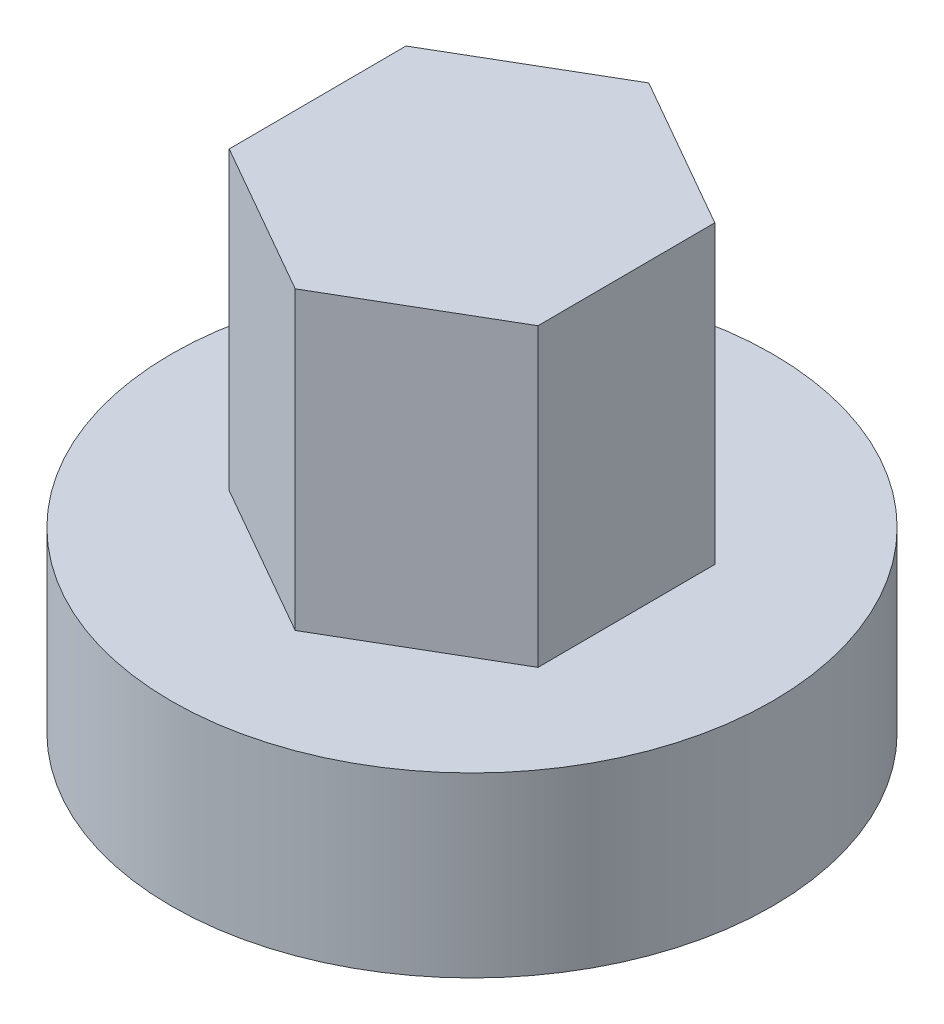
ISO-10303-21;
HEADER;
FILE_DESCRIPTION(('STEP AP214'),'2;1');
FILE_NAME('part.step','',(''),(''),'','','');
FILE_SCHEMA(('AUTOMOTIVE_DESIGN { 1 0 10303 214 1 1 1 1 }'));
ENDSEC;
DATA;
#1=APPLICATION_CONTEXT('core data for automotive mechanical design processes');
#2=APPLICATION_PROTOCOL_DEFINITION('international standard','automotive_design',2000,#1);
#3=PRODUCT_CONTEXT('',#1,'mechanical');
#4=PRODUCT('Part','Part','',(#3));
#5=PRODUCT_RELATED_PRODUCT_CATEGORY('part','',(#4));
#6=PRODUCT_DEFINITION_FORMATION('','',#4);
#7=PRODUCT_DEFINITION_CONTEXT('part definition',#1,'design');
#8=PRODUCT_DEFINITION('design','',#6,#7);
#9=PRODUCT_DEFINITION_SHAPE('','',#8);
#10=(LENGTH_UNIT() NAMED_UNIT(*) SI_UNIT(.MILLI.,.METRE.));
#11=(NAMED_UNIT(*) PLANE_ANGLE_UNIT() SI_UNIT($,.RADIAN.));
#12=(NAMED_UNIT(*) SI_UNIT($,.STERADIAN.) SOLID_ANGLE_UNIT());
#13=UNCERTAINTY_MEASURE_WITH_UNIT(LENGTH_MEASURE(1.E-05),#10,'distance_accuracy_value','');
#14=(GEOMETRIC_REPRESENTATION_CONTEXT(3) GLOBAL_UNCERTAINTY_ASSIGNED_CONTEXT((#13)) GLOBAL_UNIT_ASSIGNED_CONTEXT((#10,
#11,#12)) REPRESENTATION_CONTEXT('',''));
#15=CARTESIAN_POINT('',(0.,0.,0.));
#16=DIRECTION('',(0.,0.,1.));
#17=DIRECTION('',(1.,0.,0.));
#18=AXIS2_PLACEMENT_3D('',#15,#16,#17);
#19=CARTESIAN_POINT('',(0.,-15.,0.));
#20=DIRECTION('',(0.,1.,0.));
#21=DIRECTION('',(0.,0.,1.));
#22=AXIS2_PLACEMENT_3D('',#19,#20,#21);
#23=CYLINDRICAL_SURFACE('',#22,25.4);
#24=CARTESIAN_POINT('',(0.,-15.,0.));
#25=DIRECTION('',(0.,1.,0.));
#26=DIRECTION('',(0.,0.,1.));
#27=AXIS2_PLACEMENT_3D('',#24,#25,#26);
#28=CIRCLE('',#27,25.4);
#29=CARTESIAN_POINT('',(0.,-15.,25.4));
#30=VERTEX_POINT('',#29);
#31=EDGE_CURVE('E11',#30,#30,#28,.T.);
#32=ORIENTED_EDGE('',*,*,#31,.T.);
#33=EDGE_LOOP('',(#32));
#34=FACE_BOUND('',#33,.T.);
#35=CARTESIAN_POINT('',(0.,0.,0.));
#36=DIRECTION('',(0.,1.,0.));
#37=DIRECTION('',(0.,0.,1.));
#38=AXIS2_PLACEMENT_3D('',#35,#36,#37);
#39=CIRCLE('',#38,25.4);
#40=CARTESIAN_POINT('',(0.,0.,25.4));
#41=VERTEX_POINT('',#40);
#42=EDGE_CURVE('E48',#41,#41,#39,.T.);
#43=ORIENTED_EDGE('',*,*,#42,.F.);
#44=EDGE_LOOP('',(#43));
#45=FACE_BOUND('',#44,.T.);
#46=ADVANCED_FACE('F45',(#34,#45),#23,.T.);
#47=CARTESIAN_POINT('',(0.,-15.,0.));
#48=DIRECTION('',(0.,1.,0.));
#49=DIRECTION('',(0.,0.,1.));
#50=AXIS2_PLACEMENT_3D('',#47,#48,#49);
#51=PLANE('',#50);
#52=ORIENTED_EDGE('',*,*,#31,.F.);
#53=EDGE_LOOP('',(#52));
#54=FACE_BOUND('',#53,.T.);
#55=ADVANCED_FACE('F191',(#54),#51,.F.);
#56=CARTESIAN_POINT('',(0.,0.,0.));
#57=DIRECTION('',(0.,1.,0.));
#58=DIRECTION('',(0.,0.,1.));
#59=AXIS2_PLACEMENT_3D('',#56,#57,#58);
#60=PLANE('',#59);
#61=DIRECTION('',(-0.00429180596635259,0.,-0.999990790158363));
#62=VECTOR('',#61,1.);
#63=CARTESIAN_POINT('',(12.9902614174142,0.,-0.0557521949246244));
#64=LINE('',#63,#62);
#65=CARTESIAN_POINT('',(13.0224499621619,0.,7.44417873126309));
#66=VERTEX_POINT('',#65);
#67=CARTESIAN_POINT('',(12.9580728726666,0.,-7.55568312111235));
#68=VERTEX_POINT('',#67);
#69=EDGE_CURVE('E60',#66,#68,#64,.T.);
#70=ORIENTED_EDGE('',*,*,#69,.F.);
#71=DIRECTION('',(0.86387152484444,0.,-0.503712208074157));
#72=VECTOR('',#71,1.);
#73=CARTESIAN_POINT('',(6.54341352582859,0.,11.2220202918193));
#74=LINE('',#73,#72);
#75=CARTESIAN_POINT('',(0.0643770894952905,0.,14.9998618523754));
#76=VERTEX_POINT('',#75);
#77=EDGE_CURVE('E64',#76,#66,#74,.T.);
#78=ORIENTED_EDGE('',*,*,#77,.F.);
#79=DIRECTION('',(0.868163330810793,0.,0.496278582084206));
#80=VECTOR('',#79,1.);
#81=CARTESIAN_POINT('',(-6.44684789158565,0.,11.2777724867439));
#82=LINE('',#81,#80);
#83=CARTESIAN_POINT('',(-12.9580728726666,0.,7.55568312111235));
#84=VERTEX_POINT('',#83);
#85=EDGE_CURVE('E144',#84,#76,#82,.T.);
#86=ORIENTED_EDGE('',*,*,#85,.F.);
#87=DIRECTION('',(0.0042918059663527,0.,0.999990790158363));
#88=VECTOR('',#87,1.);
#89=CARTESIAN_POINT('',(-12.9902614174142,0.,0.0557521949246259));
#90=LINE('',#89,#88);
#91=CARTESIAN_POINT('',(-13.0224499621619,0.,-7.44417873126309));
#92=VERTEX_POINT('',#91);
#93=EDGE_CURVE('E147',#92,#84,#90,.T.);
#94=ORIENTED_EDGE('',*,*,#93,.F.);
#95=DIRECTION('',(-0.86387152484444,0.,0.503712208074157));
#96=VECTOR('',#95,1.);
#97=CARTESIAN_POINT('',(-6.54341352582859,0.,-11.2220202918193));
#98=LINE('',#97,#96);
#99=CARTESIAN_POINT('',(-0.0643770894952931,0.,-14.9998618523754));
#100=VERTEX_POINT('',#99);
#101=EDGE_CURVE('E151',#100,#92,#98,.T.);
#102=ORIENTED_EDGE('',*,*,#101,.F.);
#103=DIRECTION('',(-0.868163330810793,0.,-0.496278582084206));
#104=VECTOR('',#103,1.);
#105=CARTESIAN_POINT('',(6.44684789158565,0.,-11.2777724867439));
#106=LINE('',#105,#104);
#107=EDGE_CURVE('E155',#68,#100,#106,.T.);
#108=ORIENTED_EDGE('',*,*,#107,.F.);
#109=EDGE_LOOP('',(#70,#78,#86,#94,#102,#108));
#110=FACE_BOUND('',#109,.T.);
#111=ORIENTED_EDGE('',*,*,#42,.T.);
#112=EDGE_LOOP('',(#111));
#113=FACE_BOUND('',#112,.T.);
#114=ADVANCED_FACE('F196',(#110,#113),#60,.T.);
#115=CARTESIAN_POINT('',(12.9902614174142,25.,-0.0557521949246244));
#116=DIRECTION('',(-0.999990790158363,0.,0.00429180596635259));
#117=DIRECTION('',(0.00429180596635259,0.,0.999990790158363));
#118=AXIS2_PLACEMENT_3D('',#115,#116,#117);
#119=PLANE('',#118);
#120=ORIENTED_EDGE('',*,*,#69,.T.);
#121=DIRECTION('',(0.,-1.,0.));
#122=VECTOR('',#121,1.);
#123=CARTESIAN_POINT('',(12.9580728726666,25.,-7.55568312111235));
#124=LINE('',#123,#122);
#125=CARTESIAN_POINT('',(12.9580728726666,25.,-7.55568312111235));
#126=VERTEX_POINT('',#125);
#127=EDGE_CURVE('E101',#126,#68,#124,.T.);
#128=ORIENTED_EDGE('',*,*,#127,.F.);
#129=DIRECTION('',(-0.00429180596635259,0.,-0.999990790158363));
#130=VECTOR('',#129,1.);
#131=CARTESIAN_POINT('',(12.9902614174142,25.,-0.0557521949246244));
#132=LINE('',#131,#130);
#133=CARTESIAN_POINT('',(13.0224499621619,25.,7.44417873126309));
#134=VERTEX_POINT('',#133);
#135=EDGE_CURVE('E108',#134,#126,#132,.T.);
#136=ORIENTED_EDGE('',*,*,#135,.F.);
#137=DIRECTION('',(0.,-1.,0.));
#138=VECTOR('',#137,1.);
#139=CARTESIAN_POINT('',(13.0224499621619,25.,7.44417873126309));
#140=LINE('',#139,#138);
#141=EDGE_CURVE('E139',#134,#66,#140,.T.);
#142=ORIENTED_EDGE('',*,*,#141,.T.);
#143=EDGE_LOOP('',(#120,#128,#136,#142));
#144=FACE_BOUND('',#143,.T.);
#145=ADVANCED_FACE('F119',(#144),#119,.F.);
#146=CARTESIAN_POINT('',(6.44684789158565,25.,-11.2777724867439));
#147=DIRECTION('',(-0.496278582084206,0.,0.868163330810793));
#148=DIRECTION('',(0.868163330810793,0.,0.496278582084206));
#149=AXIS2_PLACEMENT_3D('',#146,#147,#148);
#150=PLANE('',#149);
#151=ORIENTED_EDGE('',*,*,#107,.T.);
#152=DIRECTION('',(0.,-1.,0.));
#153=VECTOR('',#152,1.);
#154=CARTESIAN_POINT('',(-0.0643770894952931,25.,-14.9998618523754));
#155=LINE('',#154,#153);
#156=CARTESIAN_POINT('',(-0.0643770894952931,25.,-14.9998618523754));
#157=VERTEX_POINT('',#156);
#158=EDGE_CURVE('E103',#157,#100,#155,.T.);
#159=ORIENTED_EDGE('',*,*,#158,.F.);
#160=DIRECTION('',(-0.868163330810793,0.,-0.496278582084206));
#161=VECTOR('',#160,1.);
#162=CARTESIAN_POINT('',(6.44684789158565,25.,-11.2777724867439));
#163=LINE('',#162,#161);
#164=EDGE_CURVE('E96',#126,#157,#163,.T.);
#165=ORIENTED_EDGE('',*,*,#164,.F.);
#166=ORIENTED_EDGE('',*,*,#127,.T.);
#167=EDGE_LOOP('',(#151,#159,#165,#166));
#168=FACE_BOUND('',#167,.T.);
#169=ADVANCED_FACE('F99',(#168),#150,.F.);
#170=CARTESIAN_POINT('',(-6.54341352582859,25.,-11.2220202918193));
#171=DIRECTION('',(0.503712208074157,0.,0.86387152484444));
#172=DIRECTION('',(0.86387152484444,0.,-0.503712208074157));
#173=AXIS2_PLACEMENT_3D('',#170,#171,#172);
#174=PLANE('',#173);
#175=ORIENTED_EDGE('',*,*,#101,.T.);
#176=DIRECTION('',(0.,-1.,0.));
#177=VECTOR('',#176,1.);
#178=CARTESIAN_POINT('',(-13.0224499621619,25.,-7.44417873126309));
#179=LINE('',#178,#177);
#180=CARTESIAN_POINT('',(-13.0224499621619,25.,-7.44417873126309));
#181=VERTEX_POINT('',#180);
#182=EDGE_CURVE('E125',#181,#92,#179,.T.);
#183=ORIENTED_EDGE('',*,*,#182,.F.);
#184=DIRECTION('',(-0.86387152484444,0.,0.503712208074157));
#185=VECTOR('',#184,1.);
#186=CARTESIAN_POINT('',(-6.54341352582859,25.,-11.2220202918193));
#187=LINE('',#186,#185);
#188=EDGE_CURVE('E107',#157,#181,#187,.T.);
#189=ORIENTED_EDGE('',*,*,#188,.F.);
#190=ORIENTED_EDGE('',*,*,#158,.T.);
#191=EDGE_LOOP('',(#175,#183,#189,#190));
#192=FACE_BOUND('',#191,.T.);
#193=ADVANCED_FACE('F173',(#192),#174,.F.);
#194=CARTESIAN_POINT('',(-12.9902614174142,25.,0.0557521949246259));
#195=DIRECTION('',(0.999990790158363,0.,-0.0042918059663527));
#196=DIRECTION('',(-0.0042918059663527,0.,-0.999990790158363));
#197=AXIS2_PLACEMENT_3D('',#194,#195,#196);
#198=PLANE('',#197);
#199=ORIENTED_EDGE('',*,*,#93,.T.);
#200=DIRECTION('',(0.,-1.,0.));
#201=VECTOR('',#200,1.);
#202=CARTESIAN_POINT('',(-12.9580728726666,25.,7.55568312111235));
#203=LINE('',#202,#201);
#204=CARTESIAN_POINT('',(-12.9580728726666,25.,7.55568312111235));
#205=VERTEX_POINT('',#204);
#206=EDGE_CURVE('E131',#205,#84,#203,.T.);
#207=ORIENTED_EDGE('',*,*,#206,.F.);
#208=DIRECTION('',(0.0042918059663527,0.,0.999990790158363));
#209=VECTOR('',#208,1.);
#210=CARTESIAN_POINT('',(-12.9902614174142,25.,0.0557521949246259));
#211=LINE('',#210,#209);
#212=EDGE_CURVE('E165',#181,#205,#211,.T.);
#213=ORIENTED_EDGE('',*,*,#212,.F.);
#214=ORIENTED_EDGE('',*,*,#182,.T.);
#215=EDGE_LOOP('',(#199,#207,#213,#214));
#216=FACE_BOUND('',#215,.T.);
#217=ADVANCED_FACE('F175',(#216),#198,.F.);
#218=CARTESIAN_POINT('',(-6.44684789158565,25.,11.2777724867439));
#219=DIRECTION('',(0.496278582084206,0.,-0.868163330810793));
#220=DIRECTION('',(-0.868163330810793,0.,-0.496278582084206));
#221=AXIS2_PLACEMENT_3D('',#218,#219,#220);
#222=PLANE('',#221);
#223=ORIENTED_EDGE('',*,*,#85,.T.);
#224=DIRECTION('',(0.,-1.,0.));
#225=VECTOR('',#224,1.);
#226=CARTESIAN_POINT('',(0.0643770894952905,25.,14.9998618523754));
#227=LINE('',#226,#225);
#228=CARTESIAN_POINT('',(0.0643770894952905,25.,14.9998618523754));
#229=VERTEX_POINT('',#228);
#230=EDGE_CURVE('E135',#229,#76,#227,.T.);
#231=ORIENTED_EDGE('',*,*,#230,.F.);
#232=DIRECTION('',(0.868163330810793,0.,0.496278582084206));
#233=VECTOR('',#232,1.);
#234=CARTESIAN_POINT('',(-6.44684789158565,25.,11.2777724867439));
#235=LINE('',#234,#233);
#236=EDGE_CURVE('E162',#205,#229,#235,.T.);
#237=ORIENTED_EDGE('',*,*,#236,.F.);
#238=ORIENTED_EDGE('',*,*,#206,.T.);
#239=EDGE_LOOP('',(#223,#231,#237,#238));
#240=FACE_BOUND('',#239,.T.);
#241=ADVANCED_FACE('F179',(#240),#222,.F.);
#242=CARTESIAN_POINT('',(6.54341352582859,25.,11.2220202918193));
#243=DIRECTION('',(-0.503712208074157,0.,-0.86387152484444));
#244=DIRECTION('',(-0.86387152484444,0.,0.503712208074157));
#245=AXIS2_PLACEMENT_3D('',#242,#243,#244);
#246=PLANE('',#245);
#247=ORIENTED_EDGE('',*,*,#77,.T.);
#248=ORIENTED_EDGE('',*,*,#141,.F.);
#249=DIRECTION('',(0.86387152484444,0.,-0.503712208074157));
#250=VECTOR('',#249,1.);
#251=CARTESIAN_POINT('',(6.54341352582859,25.,11.2220202918193));
#252=LINE('',#251,#250);
#253=EDGE_CURVE('E113',#229,#134,#252,.T.);
#254=ORIENTED_EDGE('',*,*,#253,.F.);
#255=ORIENTED_EDGE('',*,*,#230,.T.);
#256=EDGE_LOOP('',(#247,#248,#254,#255));
#257=FACE_BOUND('',#256,.T.);
#258=ADVANCED_FACE('F181',(#257),#246,.F.);
#259=CARTESIAN_POINT('',(0.,25.,0.));
#260=DIRECTION('',(0.,1.,0.));
#261=DIRECTION('',(0.,0.,1.));
#262=AXIS2_PLACEMENT_3D('',#259,#260,#261);
#263=PLANE('',#262);
#264=ORIENTED_EDGE('',*,*,#135,.T.);
#265=ORIENTED_EDGE('',*,*,#164,.T.);
#266=ORIENTED_EDGE('',*,*,#188,.T.);
#267=ORIENTED_EDGE('',*,*,#212,.T.);
#268=ORIENTED_EDGE('',*,*,#236,.T.);
#269=ORIENTED_EDGE('',*,*,#253,.T.);
#270=EDGE_LOOP('',(#264,#265,#266,#267,#268,#269));
#271=FACE_BOUND('',#270,.T.);
#272=ADVANCED_FACE('F111',(#271),#263,.T.);
#273=CLOSED_SHELL('',(#46,#55,#114,#145,#169,#193,#217,#241,#258,#272));
#274=MANIFOLD_SOLID_BREP('B2',#273);
#275=ADVANCED_BREP_SHAPE_REPRESENTATION('',(#18,#274),#14);
#276=SHAPE_DEFINITION_REPRESENTATION(#9,#275);
ENDSEC;
END-ISO-10303-21;
